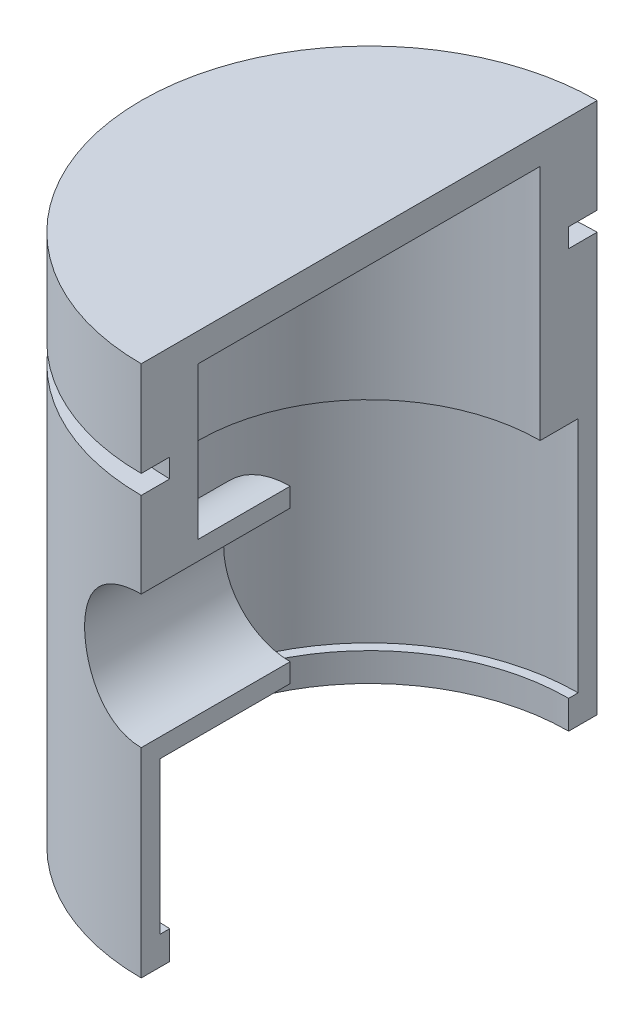
ISO-10303-21;
HEADER;
FILE_DESCRIPTION(('STEP AP214'),'2;1');
FILE_NAME('part.step','',(''),(''),'','','');
FILE_SCHEMA(('AUTOMOTIVE_DESIGN { 1 0 10303 214 1 1 1 1 }'));
ENDSEC;
DATA;
#1=APPLICATION_CONTEXT('core data for automotive mechanical design processes');
#2=APPLICATION_PROTOCOL_DEFINITION('international standard','automotive_design',2000,#1);
#3=PRODUCT_CONTEXT('',#1,'mechanical');
#4=PRODUCT('Part','Part','',(#3));
#5=PRODUCT_RELATED_PRODUCT_CATEGORY('part','',(#4));
#6=PRODUCT_DEFINITION_FORMATION('','',#4);
#7=PRODUCT_DEFINITION_CONTEXT('part definition',#1,'design');
#8=PRODUCT_DEFINITION('design','',#6,#7);
#9=PRODUCT_DEFINITION_SHAPE('','',#8);
#10=(LENGTH_UNIT() NAMED_UNIT(*) SI_UNIT(.MILLI.,.METRE.));
#11=(NAMED_UNIT(*) PLANE_ANGLE_UNIT() SI_UNIT($,.RADIAN.));
#12=(NAMED_UNIT(*) SI_UNIT($,.STERADIAN.) SOLID_ANGLE_UNIT());
#13=UNCERTAINTY_MEASURE_WITH_UNIT(LENGTH_MEASURE(1.E-05),#10,'distance_accuracy_value','');
#14=(GEOMETRIC_REPRESENTATION_CONTEXT(3) GLOBAL_UNCERTAINTY_ASSIGNED_CONTEXT((#13)) GLOBAL_UNIT_ASSIGNED_CONTEXT((#10,
#11,#12)) REPRESENTATION_CONTEXT('',''));
#15=CARTESIAN_POINT('',(0.,0.,0.));
#16=DIRECTION('',(0.,0.,1.));
#17=DIRECTION('',(1.,0.,0.));
#18=AXIS2_PLACEMENT_3D('',#15,#16,#17);
#19=CARTESIAN_POINT('',(0.,88.9,0.));
#20=DIRECTION('',(0.,-1.,0.));
#21=DIRECTION('',(0.,0.,-1.));
#22=AXIS2_PLACEMENT_3D('',#19,#20,#21);
#23=CYLINDRICAL_SURFACE('',#22,38.1);
#24=DIRECTION('',(0.,1.,0.));
#25=VECTOR('',#24,1.);
#26=CARTESIAN_POINT('',(2.66050878019847E-13,0.,38.1));
#27=LINE('',#26,#25);
#28=CARTESIAN_POINT('',(2.66050878019847E-13,55.5625,38.1));
#29=VERTEX_POINT('',#28);
#30=CARTESIAN_POINT('',(-1.13939569964848E-10,69.85,38.1));
#31=VERTEX_POINT('',#30);
#32=EDGE_CURVE('E193',#29,#31,#27,.T.);
#33=ORIENTED_EDGE('',*,*,#32,.T.);
#34=CARTESIAN_POINT('',(-1.13939569964848E-10,69.85,0.));
#35=DIRECTION('',(0.,1.,0.));
#36=DIRECTION('',(0.,0.,1.));
#37=AXIS2_PLACEMENT_3D('',#34,#35,#36);
#38=CIRCLE('',#37,38.1);
#39=CARTESIAN_POINT('',(-2.66050878019845E-13,69.85,-38.1));
#40=VERTEX_POINT('',#39);
#41=EDGE_CURVE('E238',#40,#31,#38,.T.);
#42=ORIENTED_EDGE('',*,*,#41,.F.);
#43=DIRECTION('',(0.,1.,0.));
#44=VECTOR('',#43,1.);
#45=CARTESIAN_POINT('',(0.,0.,-38.1));
#46=LINE('',#45,#44);
#47=CARTESIAN_POINT('',(0.,0.,-38.1));
#48=VERTEX_POINT('',#47);
#49=EDGE_CURVE('E161',#48,#40,#46,.T.);
#50=ORIENTED_EDGE('',*,*,#49,.F.);
#51=CARTESIAN_POINT('',(0.,0.,0.));
#52=DIRECTION('',(0.,-1.,0.));
#53=DIRECTION('',(0.,0.,-1.));
#54=AXIS2_PLACEMENT_3D('',#51,#52,#53);
#55=CIRCLE('',#54,38.1);
#56=CARTESIAN_POINT('',(2.66050878019847E-13,0.,38.1));
#57=VERTEX_POINT('',#56);
#58=EDGE_CURVE('E228',#57,#48,#55,.T.);
#59=ORIENTED_EDGE('',*,*,#58,.F.);
#60=CARTESIAN_POINT('',(2.66050878019847E-13,33.3375,38.1));
#61=VERTEX_POINT('',#60);
#62=EDGE_CURVE('E189',#57,#61,#27,.T.);
#63=ORIENTED_EDGE('',*,*,#62,.T.);
#64=CARTESIAN_POINT('',(2.58462887734062E-13,33.3375,38.1));
#65=CARTESIAN_POINT('',(-0.305678354342787,33.3374597204208,38.100035987796));
#66=CARTESIAN_POINT('',(-0.611343067187027,33.3501109122211,38.0963225756372));
#67=CARTESIAN_POINT('',(-1.22036643528183,33.4004993581627,38.0816587613897));
#68=CARTESIAN_POINT('',(-1.52372551949036,33.4382318243937,38.0707097405508));
#69=CARTESIAN_POINT('',(-2.12528794040966,33.5383714053366,38.0418693794901));
#70=CARTESIAN_POINT('',(-2.42350148923286,33.6007218416645,38.0239939877213));
#71=CARTESIAN_POINT('',(-3.01338059594607,33.7495464154225,37.9817973257887));
#72=CARTESIAN_POINT('',(-3.30504603556093,33.8360209882163,37.9574759392956));
#73=CARTESIAN_POINT('',(-3.87970046180717,34.0323351678323,37.903050144848));
#74=CARTESIAN_POINT('',(-4.16269313068352,34.1421646969586,37.8729482317401));
#75=CARTESIAN_POINT('',(-4.71837293605549,34.3843895823758,37.8077406230523));
#76=CARTESIAN_POINT('',(-4.99105614628174,34.5167934322164,37.7726330449163));
#77=CARTESIAN_POINT('',(-5.52425014222048,34.803141229302,37.6983437187217));
#78=CARTESIAN_POINT('',(-5.78476196410571,34.9570833384818,37.6591623183944));
#79=CARTESIAN_POINT('',(-6.2921527653642,35.285511814104,37.5777178046068));
#80=CARTESIAN_POINT('',(-6.53902542111964,35.4600075944861,37.5354532824231));
#81=CARTESIAN_POINT('',(-7.02337262079949,35.8328336740935,37.4478875000482));
#82=CARTESIAN_POINT('',(-7.26047055400058,36.0316418753429,37.4025372915897));
#83=CARTESIAN_POINT('',(-7.71708594981791,36.4481441738851,37.3110009807646));
#84=CARTESIAN_POINT('',(-7.93661079508992,36.6658302594346,37.2648152395192));
#85=CARTESIAN_POINT('',(-8.3569376990294,37.1189157729164,37.1728115199331));
#86=CARTESIAN_POINT('',(-8.557728080512,37.354326085366,37.1269937870161));
#87=CARTESIAN_POINT('',(-8.93905205972543,37.8411742982031,37.0370317558625));
#88=CARTESIAN_POINT('',(-9.11959317423751,38.0926061964632,36.9928868407111));
#89=CARTESIAN_POINT('',(-9.46289733979498,38.6155229659178,36.9065790625333));
#90=CARTESIAN_POINT('',(-9.62519956755111,38.8873209816083,36.8644784818506));
#91=CARTESIAN_POINT('',(-9.92625651807667,39.4442737493016,36.7845579336642));
#92=CARTESIAN_POINT('',(-10.0650108200517,39.7294287398733,36.7467380426591));
#93=CARTESIAN_POINT('',(-10.317819521083,40.311064936901,36.676556811762));
#94=CARTESIAN_POINT('',(-10.4318794298309,40.6075435994727,36.6441942546135));
#95=CARTESIAN_POINT('',(-10.6343480404657,41.2097531616247,36.5859502227347));
#96=CARTESIAN_POINT('',(-10.7227576031525,41.5154837503393,36.5600685305171));
#97=CARTESIAN_POINT('',(-10.871115093209,42.1256800228561,36.5162249312905));
#98=CARTESIAN_POINT('',(-10.9317574349854,42.4299630998495,36.4980707011447));
#99=CARTESIAN_POINT('',(-11.0274150223604,43.0428850230413,36.4692832661805));
#100=CARTESIAN_POINT('',(-11.0624306825143,43.3515237986965,36.4586499396988));
#101=CARTESIAN_POINT('',(-11.1064992498113,43.9707656263941,36.4452494461008));
#102=CARTESIAN_POINT('',(-11.1155567217645,44.2813683234472,36.4424808959453));
#103=CARTESIAN_POINT('',(-11.1076340942297,44.902206985961,36.4448965432573));
#104=CARTESIAN_POINT('',(-11.0906545183487,45.2124429586712,36.4500805807977));
#105=CARTESIAN_POINT('',(-11.0318413338738,45.819671666577,36.4679225418747));
#106=CARTESIAN_POINT('',(-10.9908717596366,46.1167562294461,36.4803205504614));
#107=CARTESIAN_POINT('',(-10.8851518848984,46.7062801588463,36.5120050016622));
#108=CARTESIAN_POINT('',(-10.8204022028777,46.9987196459817,36.5312912651241));
#109=CARTESIAN_POINT('',(-10.6676657229903,47.5769795897049,36.5761839806553));
#110=CARTESIAN_POINT('',(-10.5796776760274,47.8627996895926,36.6017907724575));
#111=CARTESIAN_POINT('',(-10.3811726513035,48.4259335276408,36.6585856499786));
#112=CARTESIAN_POINT('',(-10.2706552040327,48.7032470883877,36.6897738520118));
#113=CARTESIAN_POINT('',(-10.0263614573393,49.2511305528731,36.7572895136848));
#114=CARTESIAN_POINT('',(-9.89230339551893,49.5215672377553,36.7936781040205));
#115=CARTESIAN_POINT('',(-9.60285952953216,50.0503232948344,36.8702793143117));
#116=CARTESIAN_POINT('',(-9.44746637765217,50.3086384511258,36.9104932502279));
#117=CARTESIAN_POINT('',(-9.11644747132489,50.8114977022862,36.9936412944262));
#118=CARTESIAN_POINT('',(-8.94082159646504,51.0560417151851,37.0365754188965));
#119=CARTESIAN_POINT('',(-8.57046886013788,51.5299120895299,37.1240253510039));
#120=CARTESIAN_POINT('',(-8.37574148901862,51.7592380446651,37.1685412008234));
#121=CARTESIAN_POINT('',(-7.9603410791236,52.2100410225875,37.2597630453464));
#122=CARTESIAN_POINT('',(-7.7389473664715,52.4308510826075,37.3064861396303));
#123=CARTESIAN_POINT('',(-7.27832119188935,52.8530516897258,37.3990802196506));
#124=CARTESIAN_POINT('',(-7.03909409573695,53.0544480366098,37.4449514565498));
#125=CARTESIAN_POINT('',(-6.54415984451484,53.4366246256988,37.5346138425884));
#126=CARTESIAN_POINT('',(-6.28844549600816,53.6173957724922,37.578404069104));
#127=CARTESIAN_POINT('',(-5.76228967684859,53.9569290290611,37.662673686302));
#128=CARTESIAN_POINT('',(-5.49184868652869,54.115691856075,37.7031531848616));
#129=CARTESIAN_POINT('',(-4.93617872176475,54.4109959346664,37.7799326530135));
#130=CARTESIAN_POINT('',(-4.65086357677562,54.5473828481641,37.8162031270988));
#131=CARTESIAN_POINT('',(-4.06910117992228,54.795533764754,37.8832170466877));
#132=CARTESIAN_POINT('',(-3.77265447951865,54.9072989857336,37.913960765553));
#133=CARTESIAN_POINT('',(-3.17111218257596,55.1051317053481,37.9690024389992));
#134=CARTESIAN_POINT('',(-2.86602721581681,55.1912294024429,37.9933079644846));
#135=CARTESIAN_POINT('',(-2.24927923783436,55.3370914965828,38.0348028886745));
#136=CARTESIAN_POINT('',(-1.93761928816141,55.3968678780575,38.0519955257516));
#137=CARTESIAN_POINT('',(-1.35507672979754,55.4829149959392,38.0768440190907));
#138=CARTESIAN_POINT('',(-1.08475980909726,55.5127626797272,38.0855143169464));
#139=CARTESIAN_POINT('',(-0.542968419658551,55.5525508887319,38.0970985265773));
#140=CARTESIAN_POINT('',(-0.271496419539347,55.5625224459837,38.1000214115294));
#141=CARTESIAN_POINT('',(2.57777615826225E-13,55.5625,38.1));
#142=B_SPLINE_CURVE_WITH_KNOTS('',3,(#64,#65,#66,#67,#68,#69,#70,#71,#72,#73,#74,#75,#76,#77,
#78,#79,#80,#81,#82,#83,#84,#85,#86,#87,#88,#89,#90,#91,#92,#93,#94,#95,#96,#97,#98,#99,#100,
#101,#102,#103,#104,#105,#106,#107,#108,#109,#110,#111,#112,#113,#114,#115,#116,#117,#118,#119,
#120,#121,#122,#123,#124,#125,#126,#127,#128,#129,#130,#131,#132,#133,#134,#135,#136,#137,#138,
#139,#140,#141),.UNSPECIFIED.,.F.,.F.,(4,2,2,2,2,2,2,2,2,2,2,2,2,2,2,2,2,2,2,2,2,2,2,2,2,2,2,2,
2,2,2,2,2,2,2,2,2,2,4),(0.,0.916729941405068,1.83328493313825,2.74774191523811,3.66221540143862,
4.5762950888866,5.49071945930026,6.40506584070327,7.31983264914798,8.25693335926521,
9.19363829366308,10.1309232292311,11.0678590732304,12.0247605098971,12.9816790443075,
13.9383838552324,14.8950565563926,15.8262861939089,16.7575007668702,17.6885515734525,
18.6195836567828,19.5189832427617,20.4183594385364,21.3177839869426,22.2172272811555,
23.1282784366884,24.0396441450702,24.9510152776129,25.862410733302,26.8097755568706,
27.7568564752922,28.704353441368,29.6518195218042,30.6055684829575,31.5592702572781,
32.5118455097336,33.4639865929506,34.2795060579732,35.0937512750572),.UNSPECIFIED.);
#143=EDGE_CURVE('E239',#61,#29,#142,.T.);
#144=ORIENTED_EDGE('',*,*,#143,.T.);
#145=EDGE_LOOP('',(#33,#42,#50,#59,#63,#144));
#146=FACE_BOUND('',#145,.T.);
#147=ADVANCED_FACE('F32',(#146),#23,.T.);
#148=CARTESIAN_POINT('',(-2.66050878019847E-13,73.025,-38.1));
#149=VERTEX_POINT('',#148);
#150=CARTESIAN_POINT('',(0.,88.9,-38.1));
#151=VERTEX_POINT('',#150);
#152=EDGE_CURVE('E167',#149,#151,#46,.T.);
#153=ORIENTED_EDGE('',*,*,#152,.F.);
#154=CARTESIAN_POINT('',(-1.13939569964848E-10,73.025,0.));
#155=DIRECTION('',(0.,1.,0.));
#156=DIRECTION('',(0.,0.,1.));
#157=AXIS2_PLACEMENT_3D('',#154,#155,#156);
#158=CIRCLE('',#157,38.1);
#159=CARTESIAN_POINT('',(2.66050878019847E-13,73.025,38.1));
#160=VERTEX_POINT('',#159);
#161=EDGE_CURVE('E246',#149,#160,#158,.T.);
#162=ORIENTED_EDGE('',*,*,#161,.T.);
#163=CARTESIAN_POINT('',(2.66050878019847E-13,88.9,38.1));
#164=VERTEX_POINT('',#163);
#165=EDGE_CURVE('E188',#160,#164,#27,.T.);
#166=ORIENTED_EDGE('',*,*,#165,.T.);
#167=CARTESIAN_POINT('',(0.,88.9,0.));
#168=DIRECTION('',(0.,-1.,0.));
#169=DIRECTION('',(0.,0.,-1.));
#170=AXIS2_PLACEMENT_3D('',#167,#168,#169);
#171=CIRCLE('',#170,38.1);
#172=EDGE_CURVE('E212',#164,#151,#171,.T.);
#173=ORIENTED_EDGE('',*,*,#172,.T.);
#174=EDGE_LOOP('',(#153,#162,#166,#173));
#175=FACE_BOUND('',#174,.T.);
#176=ADVANCED_FACE('F245',(#175),#23,.T.);
#177=CARTESIAN_POINT('',(2.66050878019847E-13,84.1375,38.1));
#178=DIRECTION('',(1.,0.,0.));
#179=DIRECTION('',(0.,0.,-1.));
#180=AXIS2_PLACEMENT_3D('',#177,#178,#179);
#181=PLANE('',#180);
#182=ORIENTED_EDGE('',*,*,#49,.T.);
#183=DIRECTION('',(0.,0.,1.));
#184=VECTOR('',#183,1.);
#185=CARTESIAN_POINT('',(2.66050878019847E-13,69.85,38.1));
#186=LINE('',#185,#184);
#187=CARTESIAN_POINT('',(-2.32794518267357E-13,69.85,-33.3375));
#188=VERTEX_POINT('',#187);
#189=EDGE_CURVE('E11',#40,#188,#186,.T.);
#190=ORIENTED_EDGE('',*,*,#189,.T.);
#191=DIRECTION('',(0.,1.,0.));
#192=VECTOR('',#191,1.);
#193=CARTESIAN_POINT('',(-2.32794518267366E-13,73.025,-33.3375));
#194=LINE('',#193,#192);
#195=CARTESIAN_POINT('',(-2.32794518267357E-13,73.025,-33.3375));
#196=VERTEX_POINT('',#195);
#197=EDGE_CURVE('E36',#188,#196,#194,.T.);
#198=ORIENTED_EDGE('',*,*,#197,.T.);
#199=DIRECTION('',(0.,0.,-1.));
#200=VECTOR('',#199,1.);
#201=CARTESIAN_POINT('',(2.66050878019847E-13,73.025,38.1));
#202=LINE('',#201,#200);
#203=EDGE_CURVE('E41',#196,#149,#202,.T.);
#204=ORIENTED_EDGE('',*,*,#203,.T.);
#205=ORIENTED_EDGE('',*,*,#152,.T.);
#206=DIRECTION('',(0.,0.,-1.));
#207=VECTOR('',#206,1.);
#208=CARTESIAN_POINT('',(2.66050878019847E-13,88.9,38.1));
#209=LINE('',#208,#207);
#210=EDGE_CURVE('E192',#164,#151,#209,.T.);
#211=ORIENTED_EDGE('',*,*,#210,.F.);
#212=ORIENTED_EDGE('',*,*,#165,.F.);
#213=CARTESIAN_POINT('',(-1.13939569964848E-10,73.025,33.3375));
#214=VERTEX_POINT('',#213);
#215=EDGE_CURVE('E232',#160,#214,#202,.T.);
#216=ORIENTED_EDGE('',*,*,#215,.T.);
#217=DIRECTION('',(0.,1.,0.));
#218=VECTOR('',#217,1.);
#219=CARTESIAN_POINT('',(2.32794518267366E-13,73.025,33.3375));
#220=LINE('',#219,#218);
#221=CARTESIAN_POINT('',(2.32794518267366E-13,69.85,33.3375));
#222=VERTEX_POINT('',#221);
#223=EDGE_CURVE('E230',#214,#222,#220,.F.);
#224=ORIENTED_EDGE('',*,*,#223,.T.);
#225=EDGE_CURVE('E42',#222,#31,#186,.T.);
#226=ORIENTED_EDGE('',*,*,#225,.T.);
#227=ORIENTED_EDGE('',*,*,#32,.F.);
#228=DIRECTION('',(0.,0.,-1.));
#229=VECTOR('',#228,1.);
#230=CARTESIAN_POINT('',(2.66050878019847E-13,55.5625,38.1));
#231=LINE('',#230,#229);
#232=CARTESIAN_POINT('',(2.66051032116535E-13,55.5625,13.208));
#233=VERTEX_POINT('',#232);
#234=EDGE_CURVE('E258',#29,#233,#231,.T.);
#235=ORIENTED_EDGE('',*,*,#234,.T.);
#236=DIRECTION('',(0.,1.,0.));
#237=VECTOR('',#236,1.);
#238=CARTESIAN_POINT('',(2.66051032116535E-13,30.1625,13.208));
#239=LINE('',#238,#237);
#240=CARTESIAN_POINT('',(2.66051032116535E-13,58.7375,13.208));
#241=VERTEX_POINT('',#240);
#242=EDGE_CURVE('E307',#233,#241,#239,.T.);
#243=ORIENTED_EDGE('',*,*,#242,.T.);
#244=DIRECTION('',(0.,0.,-1.));
#245=VECTOR('',#244,1.);
#246=CARTESIAN_POINT('',(2.66051032116535E-13,58.7375,500000.));
#247=LINE('',#246,#245);
#248=CARTESIAN_POINT('',(1.99538158514885E-13,58.7375,28.575));
#249=VERTEX_POINT('',#248);
#250=EDGE_CURVE('E174',#249,#241,#247,.T.);
#251=ORIENTED_EDGE('',*,*,#250,.F.);
#252=DIRECTION('',(0.,-1.,0.));
#253=VECTOR('',#252,1.);
#254=CARTESIAN_POINT('',(1.99538158514885E-13,84.1375,28.575));
#255=LINE('',#254,#253);
#256=CARTESIAN_POINT('',(1.99538158514885E-13,84.1375,28.575));
#257=VERTEX_POINT('',#256);
#258=EDGE_CURVE('E199',#257,#249,#255,.T.);
#259=ORIENTED_EDGE('',*,*,#258,.F.);
#260=DIRECTION('',(0.,0.,1.));
#261=VECTOR('',#260,1.);
#262=CARTESIAN_POINT('',(0.,84.1375,0.));
#263=LINE('',#262,#261);
#264=CARTESIAN_POINT('',(0.,84.1375,-28.575));
#265=VERTEX_POINT('',#264);
#266=EDGE_CURVE('E196',#265,#257,#263,.T.);
#267=ORIENTED_EDGE('',*,*,#266,.F.);
#268=DIRECTION('',(0.,-1.,0.));
#269=VECTOR('',#268,1.);
#270=CARTESIAN_POINT('',(0.,84.1375,-28.575));
#271=LINE('',#270,#269);
#272=CARTESIAN_POINT('',(0.,44.45,-28.575));
#273=VERTEX_POINT('',#272);
#274=EDGE_CURVE('E166',#265,#273,#271,.T.);
#275=ORIENTED_EDGE('',*,*,#274,.T.);
#276=DIRECTION('',(0.,0.,-1.));
#277=VECTOR('',#276,1.);
#278=CARTESIAN_POINT('',(0.,44.45,-28.575));
#279=LINE('',#278,#277);
#280=CARTESIAN_POINT('',(0.,44.45,-34.925));
#281=VERTEX_POINT('',#280);
#282=EDGE_CURVE('E170',#273,#281,#279,.T.);
#283=ORIENTED_EDGE('',*,*,#282,.T.);
#284=DIRECTION('',(0.,-1.,0.));
#285=VECTOR('',#284,1.);
#286=CARTESIAN_POINT('',(0.,44.45,-34.925));
#287=LINE('',#286,#285);
#288=CARTESIAN_POINT('',(0.,4.7625,-34.925));
#289=VERTEX_POINT('',#288);
#290=EDGE_CURVE('E179',#281,#289,#287,.T.);
#291=ORIENTED_EDGE('',*,*,#290,.T.);
#292=DIRECTION('',(0.,0.,1.));
#293=VECTOR('',#292,1.);
#294=CARTESIAN_POINT('',(0.,4.7625,-34.925));
#295=LINE('',#294,#293);
#296=CARTESIAN_POINT('',(0.,4.7625,-33.3375));
#297=VERTEX_POINT('',#296);
#298=EDGE_CURVE('E182',#289,#297,#295,.T.);
#299=ORIENTED_EDGE('',*,*,#298,.T.);
#300=DIRECTION('',(0.,-1.,0.));
#301=VECTOR('',#300,1.);
#302=CARTESIAN_POINT('',(0.,4.7625,-33.3375));
#303=LINE('',#302,#301);
#304=CARTESIAN_POINT('',(0.,0.,-33.3375));
#305=VERTEX_POINT('',#304);
#306=EDGE_CURVE('E185',#297,#305,#303,.T.);
#307=ORIENTED_EDGE('',*,*,#306,.T.);
#308=DIRECTION('',(0.,0.,-1.));
#309=VECTOR('',#308,1.);
#310=CARTESIAN_POINT('',(0.,0.,-33.3375));
#311=LINE('',#310,#309);
#312=EDGE_CURVE('E164',#305,#48,#311,.T.);
#313=ORIENTED_EDGE('',*,*,#312,.T.);
#314=EDGE_LOOP('',(#182,#190,#198,#204,#205,#211,#212,#216,#224,#226,#227,#235,#243,#251,#259,
#267,#275,#283,#291,#299,#307,#313));
#315=FACE_BOUND('',#314,.T.);
#316=ADVANCED_FACE('F158',(#315),#181,.T.);
#317=CARTESIAN_POINT('',(2.66051032116535E-13,30.1625,13.208));
#318=VERTEX_POINT('',#317);
#319=CARTESIAN_POINT('',(2.66051032116535E-13,33.3375,13.208));
#320=VERTEX_POINT('',#319);
#321=EDGE_CURVE('E305',#318,#320,#239,.T.);
#322=ORIENTED_EDGE('',*,*,#321,.T.);
#323=DIRECTION('',(0.,0.,-1.));
#324=VECTOR('',#323,1.);
#325=CARTESIAN_POINT('',(2.66050878019847E-13,33.3375,38.1));
#326=LINE('',#325,#324);
#327=EDGE_CURVE('E57',#320,#61,#326,.F.);
#328=ORIENTED_EDGE('',*,*,#327,.T.);
#329=ORIENTED_EDGE('',*,*,#62,.F.);
#330=DIRECTION('',(0.,0.,1.));
#331=VECTOR('',#330,1.);
#332=CARTESIAN_POINT('',(2.32794518267366E-13,0.,33.3375));
#333=LINE('',#332,#331);
#334=CARTESIAN_POINT('',(2.32794518267366E-13,0.,33.3375));
#335=VERTEX_POINT('',#334);
#336=EDGE_CURVE('E209',#335,#57,#333,.T.);
#337=ORIENTED_EDGE('',*,*,#336,.F.);
#338=DIRECTION('',(0.,-1.,0.));
#339=VECTOR('',#338,1.);
#340=CARTESIAN_POINT('',(2.32794518267366E-13,4.7625,33.3375));
#341=LINE('',#340,#339);
#342=CARTESIAN_POINT('',(2.32794518267366E-13,4.7625,33.3375));
#343=VERTEX_POINT('',#342);
#344=EDGE_CURVE('E206',#343,#335,#341,.T.);
#345=ORIENTED_EDGE('',*,*,#344,.F.);
#346=DIRECTION('',(0.,0.,-1.));
#347=VECTOR('',#346,1.);
#348=CARTESIAN_POINT('',(2.43879971518193E-13,4.7625,34.925));
#349=LINE('',#348,#347);
#350=CARTESIAN_POINT('',(2.43879971518193E-13,4.7625,34.925));
#351=VERTEX_POINT('',#350);
#352=EDGE_CURVE('E203',#351,#343,#349,.T.);
#353=ORIENTED_EDGE('',*,*,#352,.F.);
#354=DIRECTION('',(0.,-1.,0.));
#355=VECTOR('',#354,1.);
#356=CARTESIAN_POINT('',(2.43879971518193E-13,44.45,34.925));
#357=LINE('',#356,#355);
#358=CARTESIAN_POINT('',(2.66051032116535E-13,30.1625,34.924999999987));
#359=VERTEX_POINT('',#358);
#360=EDGE_CURVE('E201',#359,#351,#357,.T.);
#361=ORIENTED_EDGE('',*,*,#360,.F.);
#362=DIRECTION('',(0.,0.,-1.));
#363=VECTOR('',#362,1.);
#364=CARTESIAN_POINT('',(2.66051032116535E-13,30.1625,500000.));
#365=LINE('',#364,#363);
#366=EDGE_CURVE('E302',#359,#318,#365,.T.);
#367=ORIENTED_EDGE('',*,*,#366,.T.);
#368=EDGE_LOOP('',(#322,#328,#329,#337,#345,#353,#361,#367));
#369=FACE_BOUND('',#368,.T.);
#370=ADVANCED_FACE('F294',(#369),#181,.T.);
#371=CARTESIAN_POINT('',(0.,44.45,13.208));
#372=DIRECTION('',(0.,0.,1.));
#373=DIRECTION('',(1.,0.,0.));
#374=AXIS2_PLACEMENT_3D('',#371,#372,#373);
#375=PLANE('',#374);
#376=CARTESIAN_POINT('',(0.,44.45,13.208));
#377=DIRECTION('',(0.,0.,1.));
#378=DIRECTION('',(1.,0.,0.));
#379=AXIS2_PLACEMENT_3D('',#376,#377,#378);
#380=CIRCLE('',#379,11.1125);
#381=EDGE_CURVE('E253',#233,#320,#380,.T.);
#382=ORIENTED_EDGE('',*,*,#381,.T.);
#383=ORIENTED_EDGE('',*,*,#321,.F.);
#384=CARTESIAN_POINT('',(0.,44.45,13.208));
#385=DIRECTION('',(0.,0.,1.));
#386=DIRECTION('',(1.,0.,0.));
#387=AXIS2_PLACEMENT_3D('',#384,#385,#386);
#388=CIRCLE('',#387,14.2875);
#389=EDGE_CURVE('E172',#241,#318,#388,.T.);
#390=ORIENTED_EDGE('',*,*,#389,.F.);
#391=ORIENTED_EDGE('',*,*,#242,.F.);
#392=EDGE_LOOP('',(#382,#383,#390,#391));
#393=FACE_BOUND('',#392,.T.);
#394=ADVANCED_FACE('F293',(#393),#375,.F.);
#395=CARTESIAN_POINT('',(0.,88.9,0.));
#396=DIRECTION('',(0.,-1.,0.));
#397=DIRECTION('',(0.,0.,-1.));
#398=AXIS2_PLACEMENT_3D('',#395,#396,#397);
#399=CYLINDRICAL_SURFACE('',#398,34.925);
#400=CARTESIAN_POINT('',(0.,44.45,0.));
#401=DIRECTION('',(0.,-1.,0.));
#402=DIRECTION('',(0.,0.,-1.));
#403=AXIS2_PLACEMENT_3D('',#400,#401,#402);
#404=CIRCLE('',#403,34.925);
#405=CARTESIAN_POINT('',(-14.2875,44.45,31.868840091067));
#406=VERTEX_POINT('',#405);
#407=EDGE_CURVE('E220',#406,#281,#404,.T.);
#408=ORIENTED_EDGE('',*,*,#407,.F.);
#409=CARTESIAN_POINT('',(2.69111403772199E-13,30.1625,34.925));
#410=CARTESIAN_POINT('',(-0.192474184635947,30.1624993128635,34.9250019978813));
#411=CARTESIAN_POINT('',(-0.384923227273823,30.1663901184422,34.9234083671326));
#412=CARTESIAN_POINT('',(-0.76944780309631,30.181936506362,34.9170521663257));
#413=CARTESIAN_POINT('',(-0.961523350115081,30.1935917953949,34.9122897159717));
#414=CARTESIAN_POINT('',(-1.53652557669252,30.2401612238534,34.8932890764401));
#415=CARTESIAN_POINT('',(-1.91843046798924,30.2866789660849,34.8743375524495));
#416=CARTESIAN_POINT('',(-2.67505364227229,30.4099430419018,34.8244601771272));
#417=CARTESIAN_POINT('',(-3.04979284547093,30.4865799640863,34.7935776732804));
#418=CARTESIAN_POINT('',(-3.79092495136769,30.6693178694425,34.7206444688672));
#419=CARTESIAN_POINT('',(-4.15731750283842,30.7754200900461,34.6785932992621));
#420=CARTESIAN_POINT('',(-4.87898547278904,31.0159861877003,34.584439615668));
#421=CARTESIAN_POINT('',(-5.23426967244899,31.1504269769328,34.5323452869104));
#422=CARTESIAN_POINT('',(-5.93185702844314,31.4465648395648,34.4193777844227));
#423=CARTESIAN_POINT('',(-6.27415930952691,31.6082637467389,34.3585040201008));
#424=CARTESIAN_POINT('',(-6.94401257313327,31.9577559667997,34.2294135175637));
#425=CARTESIAN_POINT('',(-7.27155348320682,32.145566750609,34.1611918699737));
#426=CARTESIAN_POINT('',(-7.90988396972783,32.5458690238221,34.0190578865656));
#427=CARTESIAN_POINT('',(-8.22067305599507,32.7583612348633,33.9451453843791));
#428=CARTESIAN_POINT('',(-8.83714181762449,33.2165030433805,33.7900274413123));
#429=CARTESIAN_POINT('',(-9.14200033984736,33.4631977889605,33.7086443379055));
#430=CARTESIAN_POINT('',(-9.73017641118576,33.9805311067639,33.5435931319599));
#431=CARTESIAN_POINT('',(-10.0134870060445,34.2511773484995,33.4599243034808));
#432=CARTESIAN_POINT('',(-10.5569976828584,34.8148673053499,33.2924364014067));
#433=CARTESIAN_POINT('',(-10.8171914100279,35.1079171382346,33.2086172929207));
#434=CARTESIAN_POINT('',(-11.3129043923858,35.7147632380793,33.0430344584283));
#435=CARTESIAN_POINT('',(-11.5484222951014,36.0285606406699,32.9612708452694));
#436=CARTESIAN_POINT('',(-12.0039615864213,36.6907042117588,32.7981987604246));
#437=CARTESIAN_POINT('',(-12.2227018592446,37.0399851039054,32.7170993535444));
#438=CARTESIAN_POINT('',(-12.6297067834672,37.7572346846358,32.5621491459737));
#439=CARTESIAN_POINT('',(-12.8179834261251,38.1251959448552,32.488295497697));
#440=CARTESIAN_POINT('',(-13.1623429641343,38.8771880828182,32.3503129130789));
#441=CARTESIAN_POINT('',(-13.3184584535848,39.2612022119149,32.2861741487074));
#442=CARTESIAN_POINT('',(-13.5971435210784,40.042913493638,32.1698020701762));
#443=CARTESIAN_POINT('',(-13.7197221306563,40.4406069298642,32.1175655513577));
#444=CARTESIAN_POINT('',(-13.9012031559534,41.1362753801616,32.0393358854775));
#445=CARTESIAN_POINT('',(-13.9683514625521,41.4317613715622,32.0100728558635));
#446=CARTESIAN_POINT('',(-14.083809078623,42.0270150542816,31.959441672483));
#447=CARTESIAN_POINT('',(-14.1321225978251,42.3267817732776,31.9380717545974));
#448=CARTESIAN_POINT('',(-14.2096321287342,42.9296534801564,31.9036656849194));
#449=CARTESIAN_POINT('',(-14.2388029132565,43.2327623400442,31.8906405307778));
#450=CARTESIAN_POINT('',(-14.2777524936217,43.8405759863724,31.8732094753367));
#451=CARTESIAN_POINT('',(-14.2875244328696,44.1452812989449,31.8688066216293));
#452=CARTESIAN_POINT('',(-14.2875,44.45,31.868840091067));
#453=B_SPLINE_CURVE_WITH_KNOTS('',3,(#409,#410,#411,#412,#413,#414,#415,#416,#417,#418,#419,
#420,#421,#422,#423,#424,#425,#426,#427,#428,#429,#430,#431,#432,#433,#434,#435,#436,#437,#438,
#439,#440,#441,#442,#443,#444,#445,#446,#447,#448,#449,#450,#451,#452),.UNSPECIFIED.,.F.,.F.,(4,
2,2,2,2,2,2,2,2,2,2,2,2,2,2,2,2,2,2,2,2,4),(0.,0.577326682219613,1.15463155679875,
2.3086355158648,3.45848560430554,4.60838398943291,5.75734913279838,6.90639160302036,
8.05620660733452,9.20605523849049,10.4063074359767,11.6069453667318,12.8079123360241,
14.0089450954768,15.2674586548877,16.5254756198698,17.7822112916108,19.0386081885655,
19.9512350603415,20.8636578353999,21.7772806416213,22.6912263138194),.UNSPECIFIED.);
#454=EDGE_CURVE('E296',#359,#406,#453,.T.);
#455=ORIENTED_EDGE('',*,*,#454,.F.);
#456=ORIENTED_EDGE('',*,*,#360,.T.);
#457=CARTESIAN_POINT('',(0.,4.7625,0.));
#458=DIRECTION('',(0.,-1.,0.));
#459=DIRECTION('',(0.,0.,-1.));
#460=AXIS2_PLACEMENT_3D('',#457,#458,#459);
#461=CIRCLE('',#460,34.925);
#462=EDGE_CURVE('E222',#351,#289,#461,.T.);
#463=ORIENTED_EDGE('',*,*,#462,.T.);
#464=ORIENTED_EDGE('',*,*,#290,.F.);
#465=EDGE_LOOP('',(#408,#455,#456,#463,#464));
#466=FACE_BOUND('',#465,.T.);
#467=ADVANCED_FACE('F321',(#466),#399,.F.);
#468=CARTESIAN_POINT('',(1.99538158514885E-13,44.45,28.575));
#469=DIRECTION('',(0.,-1.,0.));
#470=DIRECTION('',(0.,0.,-1.));
#471=AXIS2_PLACEMENT_3D('',#468,#469,#470);
#472=PLANE('',#471);
#473=CARTESIAN_POINT('',(0.,44.45,0.));
#474=DIRECTION('',(0.,-1.,0.));
#475=DIRECTION('',(0.,0.,-1.));
#476=AXIS2_PLACEMENT_3D('',#473,#474,#475);
#477=CIRCLE('',#476,28.575);
#478=CARTESIAN_POINT('',(-14.2875,44.45,24.7466759131403));
#479=VERTEX_POINT('',#478);
#480=EDGE_CURVE('E218',#479,#273,#477,.T.);
#481=ORIENTED_EDGE('',*,*,#480,.F.);
#482=DIRECTION('',(0.,0.,-1.));
#483=VECTOR('',#482,1.);
#484=CARTESIAN_POINT('',(-14.2875,44.45,500000.));
#485=LINE('',#484,#483);
#486=EDGE_CURVE('E288',#406,#479,#485,.T.);
#487=ORIENTED_EDGE('',*,*,#486,.F.);
#488=ORIENTED_EDGE('',*,*,#407,.T.);
#489=ORIENTED_EDGE('',*,*,#282,.F.);
#490=EDGE_LOOP('',(#481,#487,#488,#489));
#491=FACE_BOUND('',#490,.T.);
#492=ADVANCED_FACE('F327',(#491),#472,.T.);
#493=CARTESIAN_POINT('',(0.,88.9,0.));
#494=DIRECTION('',(0.,-1.,0.));
#495=DIRECTION('',(0.,0.,-1.));
#496=AXIS2_PLACEMENT_3D('',#493,#494,#495);
#497=CYLINDRICAL_SURFACE('',#496,28.575);
#498=ORIENTED_EDGE('',*,*,#258,.T.);
#499=CARTESIAN_POINT('',(-14.2875,44.45,24.7466759131403));
#500=CARTESIAN_POINT('',(-14.2875013893991,44.6370990320755,24.7466716190234));
#501=CARTESIAN_POINT('',(-14.2838240174678,44.8241716225805,24.748798666092));
#502=CARTESIAN_POINT('',(-14.2691359616553,45.197925267408,24.7572714307967));
#503=CARTESIAN_POINT('',(-14.2581255878836,45.3846063379529,24.7636169700346));
#504=CARTESIAN_POINT('',(-14.2141557198852,45.9432615796254,24.7889012616933));
#505=CARTESIAN_POINT('',(-14.1702573890742,46.3141667120773,24.8140878359909));
#506=CARTESIAN_POINT('',(-14.0542225625387,47.0478239011812,24.8799885932713));
#507=CARTESIAN_POINT('',(-13.9822517542267,47.4106108258448,24.9206116325931));
#508=CARTESIAN_POINT('',(-13.8109493854304,48.1278073147821,25.0159528308046));
#509=CARTESIAN_POINT('',(-13.7116146841675,48.482215912333,25.0706726076458));
#510=CARTESIAN_POINT('',(-13.4869252219168,49.1796362034532,25.1922553528521));
#511=CARTESIAN_POINT('',(-13.3616274965801,49.5226709983217,25.2590916639729));
#512=CARTESIAN_POINT('',(-13.0860595874207,50.1963156874405,25.4029488388703));
#513=CARTESIAN_POINT('',(-12.9357897187854,50.526925738446,25.4799695741009));
#514=CARTESIAN_POINT('',(-12.6112461172298,51.1746204669673,25.6421534257252));
#515=CARTESIAN_POINT('',(-12.4369407100833,51.4916865618276,25.7273272402541));
#516=CARTESIAN_POINT('',(-12.0655667627665,52.1106177667553,25.9035707525824));
#517=CARTESIAN_POINT('',(-11.8684898405845,52.4124772202939,25.9946426159502));
#518=CARTESIAN_POINT('',(-11.4357385137634,53.0236779176475,26.1880727545045));
#519=CARTESIAN_POINT('',(-11.1982268542475,53.3316200585016,26.2907456218643));
#520=CARTESIAN_POINT('',(-10.6992160303079,53.9268281362425,26.4977426603409));
#521=CARTESIAN_POINT('',(-10.4377156403982,54.2140930154733,26.602066915595));
#522=CARTESIAN_POINT('',(-9.89188651450737,54.7666913627869,26.8098210516818));
#523=CARTESIAN_POINT('',(-9.60754728403337,55.0320146336922,26.9132504968878));
#524=CARTESIAN_POINT('',(-9.0175680686384,55.5390652451518,27.1166262206457));
#525=CARTESIAN_POINT('',(-8.71193527012457,55.7808004809915,27.2165736574285));
#526=CARTESIAN_POINT('',(-8.05910733023858,56.2549610707151,27.4172540889976));
#527=CARTESIAN_POINT('',(-7.71049923076939,56.4856214885392,27.5175740671497));
#528=CARTESIAN_POINT('',(-6.9924224899374,56.9165155177126,27.708747491247));
#529=CARTESIAN_POINT('',(-6.62295182385051,57.1167461688505,27.7996000159273));
#530=CARTESIAN_POINT('',(-5.86603038409157,57.4845368486027,27.9690993028442));
#531=CARTESIAN_POINT('',(-5.47860463138496,57.652140743688,28.0477624242039));
#532=CARTESIAN_POINT('',(-4.68813333501784,57.9530659429159,28.1906580656003));
#533=CARTESIAN_POINT('',(-4.2850918662857,58.0863961223849,28.2548943209909));
#534=CARTESIAN_POINT('',(-3.56319839557839,58.2898659079623,28.3537292328535));
#535=CARTESIAN_POINT('',(-3.24690096613337,58.3674924647188,28.391744814505));
#536=CARTESIAN_POINT('',(-2.60875705113279,58.5010951684852,28.4574747860559));
#537=CARTESIAN_POINT('',(-2.28691181194253,58.5570761138295,28.4851914589333));
#538=CARTESIAN_POINT('',(-1.63860416744157,58.6470039735283,28.5298313346679));
#539=CARTESIAN_POINT('',(-1.31213236571526,58.6808964492828,28.5467278687566));
#540=CARTESIAN_POINT('',(-0.657113981153213,58.7261674836333,28.5693344022367));
#541=CARTESIAN_POINT('',(-0.328566600205583,58.7375367767351,28.575039797854));
#542=CARTESIAN_POINT('',(1.94872661911202E-13,58.7375,28.575));
#543=B_SPLINE_CURVE_WITH_KNOTS('',3,(#499,#500,#501,#502,#503,#504,#505,#506,#507,#508,#509,
#510,#511,#512,#513,#514,#515,#516,#517,#518,#519,#520,#521,#522,#523,#524,#525,#526,#527,#528,
#529,#530,#531,#532,#533,#534,#535,#536,#537,#538,#539,#540,#541,#542),.UNSPECIFIED.,.F.,.F.,(4,
2,2,2,2,2,2,2,2,2,2,2,2,2,2,2,2,2,2,2,2,4),(0.,0.561196645734595,1.12236956021402,
2.24376213345243,3.35863388316739,4.47363364922354,5.58620946657034,6.69877124253418,
7.81281342792339,8.92726699754184,10.132651116128,11.3380968471755,12.544099686962,
13.7496974639476,15.0376775148108,16.3257827804411,17.6121440504009,18.8981718752333,
19.8809946409136,20.8635994123014,21.8486168155823,22.8340393471959),.UNSPECIFIED.);
#544=EDGE_CURVE('E281',#479,#249,#543,.T.);
#545=ORIENTED_EDGE('',*,*,#544,.F.);
#546=ORIENTED_EDGE('',*,*,#480,.T.);
#547=ORIENTED_EDGE('',*,*,#274,.F.);
#548=CARTESIAN_POINT('',(0.,84.1375,0.));
#549=DIRECTION('',(0.,-1.,0.));
#550=DIRECTION('',(0.,0.,-1.));
#551=AXIS2_PLACEMENT_3D('',#548,#549,#550);
#552=CIRCLE('',#551,28.575);
#553=EDGE_CURVE('E215',#257,#265,#552,.T.);
#554=ORIENTED_EDGE('',*,*,#553,.F.);
#555=EDGE_LOOP('',(#498,#545,#546,#547,#554));
#556=FACE_BOUND('',#555,.T.);
#557=ADVANCED_FACE('F331',(#556),#497,.F.);
#558=CARTESIAN_POINT('',(2.32794518267366E-13,0.,33.3375));
#559=DIRECTION('',(0.,-1.,0.));
#560=DIRECTION('',(0.,0.,-1.));
#561=AXIS2_PLACEMENT_3D('',#558,#559,#560);
#562=PLANE('',#561);
#563=CARTESIAN_POINT('',(0.,0.,0.));
#564=DIRECTION('',(0.,-1.,0.));
#565=DIRECTION('',(0.,0.,-1.));
#566=AXIS2_PLACEMENT_3D('',#563,#564,#565);
#567=CIRCLE('',#566,33.3375);
#568=EDGE_CURVE('E226',#335,#305,#567,.T.);
#569=ORIENTED_EDGE('',*,*,#568,.F.);
#570=ORIENTED_EDGE('',*,*,#336,.T.);
#571=ORIENTED_EDGE('',*,*,#58,.T.);
#572=ORIENTED_EDGE('',*,*,#312,.F.);
#573=EDGE_LOOP('',(#569,#570,#571,#572));
#574=FACE_BOUND('',#573,.T.);
#575=ADVANCED_FACE('F34',(#574),#562,.T.);
#576=CARTESIAN_POINT('',(0.,88.9,0.));
#577=DIRECTION('',(0.,-1.,0.));
#578=DIRECTION('',(0.,0.,-1.));
#579=AXIS2_PLACEMENT_3D('',#576,#577,#578);
#580=CYLINDRICAL_SURFACE('',#579,33.3375);
#581=CARTESIAN_POINT('',(0.,4.7625,0.));
#582=DIRECTION('',(0.,-1.,0.));
#583=DIRECTION('',(0.,0.,-1.));
#584=AXIS2_PLACEMENT_3D('',#581,#582,#583);
#585=CIRCLE('',#584,33.3375);
#586=EDGE_CURVE('E224',#343,#297,#585,.T.);
#587=ORIENTED_EDGE('',*,*,#586,.F.);
#588=ORIENTED_EDGE('',*,*,#344,.T.);
#589=ORIENTED_EDGE('',*,*,#568,.T.);
#590=ORIENTED_EDGE('',*,*,#306,.F.);
#591=EDGE_LOOP('',(#587,#588,#589,#590));
#592=FACE_BOUND('',#591,.T.);
#593=ADVANCED_FACE('F341',(#592),#580,.F.);
#594=CARTESIAN_POINT('',(2.43879971518193E-13,4.7625,34.925));
#595=DIRECTION('',(0.,1.,0.));
#596=DIRECTION('',(0.,0.,1.));
#597=AXIS2_PLACEMENT_3D('',#594,#595,#596);
#598=PLANE('',#597);
#599=ORIENTED_EDGE('',*,*,#462,.F.);
#600=ORIENTED_EDGE('',*,*,#352,.T.);
#601=ORIENTED_EDGE('',*,*,#586,.T.);
#602=ORIENTED_EDGE('',*,*,#298,.F.);
#603=EDGE_LOOP('',(#599,#600,#601,#602));
#604=FACE_BOUND('',#603,.T.);
#605=ADVANCED_FACE('F335',(#604),#598,.T.);
#606=CARTESIAN_POINT('',(0.,84.1375,0.));
#607=DIRECTION('',(0.,-1.,0.));
#608=DIRECTION('',(0.,0.,-1.));
#609=AXIS2_PLACEMENT_3D('',#606,#607,#608);
#610=PLANE('',#609);
#611=ORIENTED_EDGE('',*,*,#553,.T.);
#612=ORIENTED_EDGE('',*,*,#266,.T.);
#613=EDGE_LOOP('',(#611,#612));
#614=FACE_BOUND('',#613,.T.);
#615=ADVANCED_FACE('F333',(#614),#610,.T.);
#616=CARTESIAN_POINT('',(2.66050878019847E-13,88.9,38.1));
#617=DIRECTION('',(0.,1.,0.));
#618=DIRECTION('',(0.,0.,1.));
#619=AXIS2_PLACEMENT_3D('',#616,#617,#618);
#620=PLANE('',#619);
#621=ORIENTED_EDGE('',*,*,#210,.T.);
#622=ORIENTED_EDGE('',*,*,#172,.F.);
#623=EDGE_LOOP('',(#621,#622));
#624=FACE_BOUND('',#623,.T.);
#625=ADVANCED_FACE('F249',(#624),#620,.T.);
#626=CARTESIAN_POINT('',(0.,44.45,500000.));
#627=DIRECTION('',(0.,0.,-1.));
#628=DIRECTION('',(-1.,0.,0.));
#629=AXIS2_PLACEMENT_3D('',#626,#627,#628);
#630=CYLINDRICAL_SURFACE('',#629,14.2875);
#631=ORIENTED_EDGE('',*,*,#486,.T.);
#632=ORIENTED_EDGE('',*,*,#544,.T.);
#633=ORIENTED_EDGE('',*,*,#250,.T.);
#634=ORIENTED_EDGE('',*,*,#389,.T.);
#635=ORIENTED_EDGE('',*,*,#366,.F.);
#636=ORIENTED_EDGE('',*,*,#454,.T.);
#637=EDGE_LOOP('',(#631,#632,#633,#634,#635,#636));
#638=FACE_BOUND('',#637,.T.);
#639=ADVANCED_FACE('F275',(#638),#630,.T.);
#640=CARTESIAN_POINT('',(0.,44.45,38.1));
#641=DIRECTION('',(0.,0.,-1.));
#642=DIRECTION('',(-1.,0.,0.));
#643=AXIS2_PLACEMENT_3D('',#640,#641,#642);
#644=CYLINDRICAL_SURFACE('',#643,11.1125);
#645=ORIENTED_EDGE('',*,*,#381,.F.);
#646=ORIENTED_EDGE('',*,*,#234,.F.);
#647=ORIENTED_EDGE('',*,*,#143,.F.);
#648=ORIENTED_EDGE('',*,*,#327,.F.);
#649=EDGE_LOOP('',(#645,#646,#647,#648));
#650=FACE_BOUND('',#649,.T.);
#651=ADVANCED_FACE('F270',(#650),#644,.F.);
#652=CARTESIAN_POINT('',(-1.1417236461795E-10,69.85,-33.3375));
#653=DIRECTION('',(0.,1.,0.));
#654=DIRECTION('',(0.,0.,1.));
#655=AXIS2_PLACEMENT_3D('',#652,#653,#654);
#656=PLANE('',#655);
#657=ORIENTED_EDGE('',*,*,#41,.T.);
#658=ORIENTED_EDGE('',*,*,#225,.F.);
#659=CARTESIAN_POINT('',(-1.13939569964848E-10,69.85,0.));
#660=DIRECTION('',(0.,1.,0.));
#661=DIRECTION('',(0.,0.,1.));
#662=AXIS2_PLACEMENT_3D('',#659,#660,#661);
#663=CIRCLE('',#662,33.3375);
#664=EDGE_CURVE('E49',#188,#222,#663,.T.);
#665=ORIENTED_EDGE('',*,*,#664,.F.);
#666=ORIENTED_EDGE('',*,*,#189,.F.);
#667=EDGE_LOOP('',(#657,#658,#665,#666));
#668=FACE_BOUND('',#667,.T.);
#669=ADVANCED_FACE('F152',(#668),#656,.T.);
#670=CARTESIAN_POINT('',(-1.14205620996964E-10,73.025,-38.1));
#671=DIRECTION('',(0.,-1.,0.));
#672=DIRECTION('',(0.,0.,-1.));
#673=AXIS2_PLACEMENT_3D('',#670,#671,#672);
#674=PLANE('',#673);
#675=ORIENTED_EDGE('',*,*,#161,.F.);
#676=ORIENTED_EDGE('',*,*,#203,.F.);
#677=CARTESIAN_POINT('',(-1.13939569964848E-10,73.025,0.));
#678=DIRECTION('',(0.,1.,0.));
#679=DIRECTION('',(0.,0.,1.));
#680=AXIS2_PLACEMENT_3D('',#677,#678,#679);
#681=CIRCLE('',#680,33.3375);
#682=EDGE_CURVE('E148',#196,#214,#681,.T.);
#683=ORIENTED_EDGE('',*,*,#682,.T.);
#684=ORIENTED_EDGE('',*,*,#215,.F.);
#685=EDGE_LOOP('',(#675,#676,#683,#684));
#686=FACE_BOUND('',#685,.T.);
#687=ADVANCED_FACE('F251',(#686),#674,.T.);
#688=CARTESIAN_POINT('',(-1.13939569964848E-10,73.025,0.));
#689=DIRECTION('',(0.,1.,0.));
#690=DIRECTION('',(0.,0.,1.));
#691=AXIS2_PLACEMENT_3D('',#688,#689,#690);
#692=CYLINDRICAL_SURFACE('',#691,33.3375);
#693=ORIENTED_EDGE('',*,*,#664,.T.);
#694=ORIENTED_EDGE('',*,*,#223,.F.);
#695=ORIENTED_EDGE('',*,*,#682,.F.);
#696=ORIENTED_EDGE('',*,*,#197,.F.);
#697=EDGE_LOOP('',(#693,#694,#695,#696));
#698=FACE_BOUND('',#697,.T.);
#699=ADVANCED_FACE('F146',(#698),#692,.T.);
#700=CLOSED_SHELL('',(#147,#176,#316,#370,#394,#467,#492,#557,#575,#593,#605,#615,#625,#639,
#651,#669,#687,#699));
#701=MANIFOLD_SOLID_BREP('B2',#700);
#702=ADVANCED_BREP_SHAPE_REPRESENTATION('',(#18,#701),#14);
#703=SHAPE_DEFINITION_REPRESENTATION(#9,#702);
ENDSEC;
END-ISO-10303-21;
